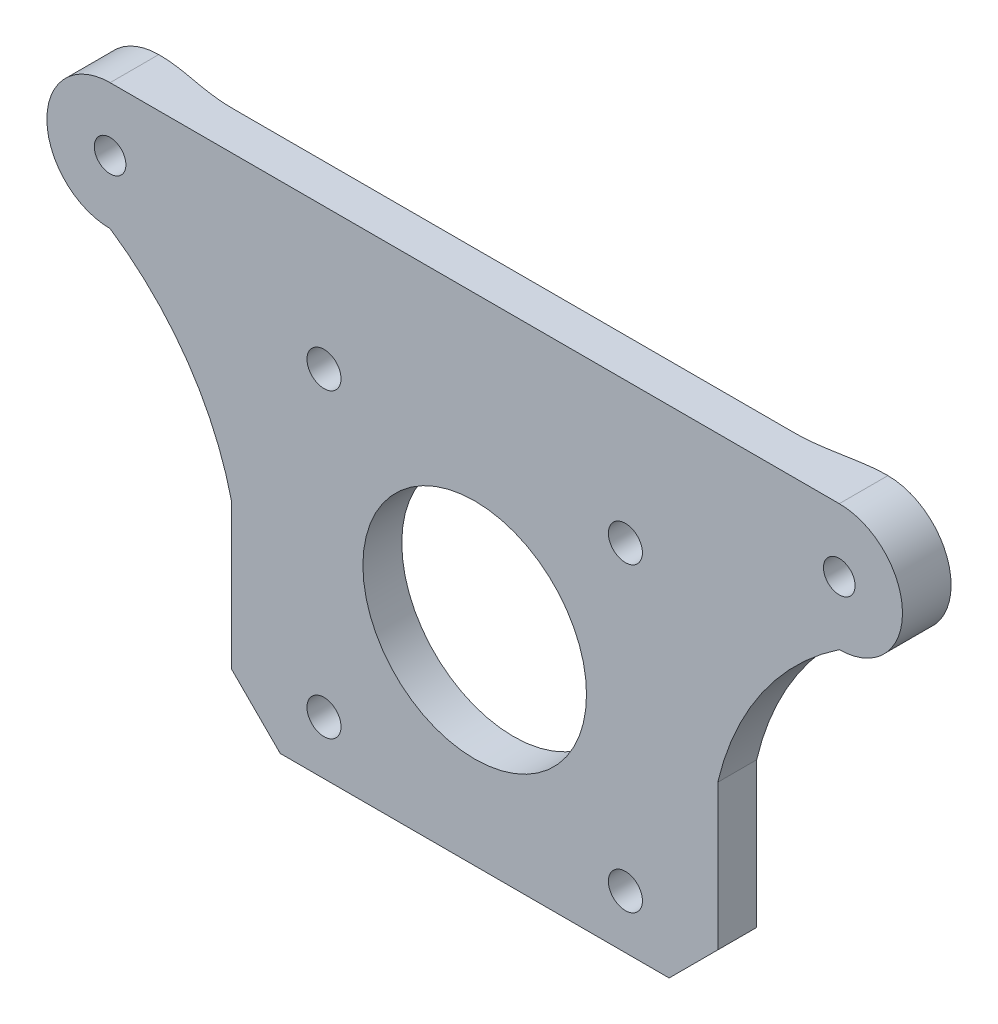
ISO-10303-21;
HEADER;
FILE_DESCRIPTION(('STEP AP214'),'2;1');
FILE_NAME('part.step','',(''),(''),'','','');
FILE_SCHEMA(('AUTOMOTIVE_DESIGN { 1 0 10303 214 1 1 1 1 }'));
ENDSEC;
DATA;
#1=APPLICATION_CONTEXT('core data for automotive mechanical design processes');
#2=APPLICATION_PROTOCOL_DEFINITION('international standard','automotive_design',2000,#1);
#3=PRODUCT_CONTEXT('',#1,'mechanical');
#4=PRODUCT('Part','Part','',(#3));
#5=PRODUCT_RELATED_PRODUCT_CATEGORY('part','',(#4));
#6=PRODUCT_DEFINITION_FORMATION('','',#4);
#7=PRODUCT_DEFINITION_CONTEXT('part definition',#1,'design');
#8=PRODUCT_DEFINITION('design','',#6,#7);
#9=PRODUCT_DEFINITION_SHAPE('','',#8);
#10=(LENGTH_UNIT() NAMED_UNIT(*) SI_UNIT(.MILLI.,.METRE.));
#11=(NAMED_UNIT(*) PLANE_ANGLE_UNIT() SI_UNIT($,.RADIAN.));
#12=(NAMED_UNIT(*) SI_UNIT($,.STERADIAN.) SOLID_ANGLE_UNIT());
#13=UNCERTAINTY_MEASURE_WITH_UNIT(LENGTH_MEASURE(1.E-05),#10,'distance_accuracy_value','');
#14=(GEOMETRIC_REPRESENTATION_CONTEXT(3) GLOBAL_UNCERTAINTY_ASSIGNED_CONTEXT((#13)) GLOBAL_UNIT_ASSIGNED_CONTEXT((#10,
#11,#12)) REPRESENTATION_CONTEXT('',''));
#15=CARTESIAN_POINT('',(0.,0.,0.));
#16=DIRECTION('',(0.,0.,1.));
#17=DIRECTION('',(1.,0.,0.));
#18=AXIS2_PLACEMENT_3D('',#15,#16,#17);
#19=CARTESIAN_POINT('',(-45.0000000000002,19.9343971588724,4.));
#20=DIRECTION('',(1.,0.,0.));
#21=DIRECTION('',(0.,0.,-1.));
#22=AXIS2_PLACEMENT_3D('',#19,#20,#21);
#23=PLANE('',#22);
#24=DIRECTION('',(0.,-1.,0.));
#25=VECTOR('',#24,1.);
#26=CARTESIAN_POINT('',(-45.0000000000002,19.9343971588724,0.));
#27=LINE('',#26,#25);
#28=CARTESIAN_POINT('',(-45.0000000000002,19.9343971588724,0.));
#29=VERTEX_POINT('',#28);
#30=CARTESIAN_POINT('',(-45.0000000000002,5.,0.));
#31=VERTEX_POINT('',#30);
#32=EDGE_CURVE('E154',#29,#31,#27,.T.);
#33=ORIENTED_EDGE('',*,*,#32,.T.);
#34=DIRECTION('',(0.,0.,-1.));
#35=VECTOR('',#34,1.);
#36=CARTESIAN_POINT('',(-45.0000000000002,5.,4.));
#37=LINE('',#36,#35);
#38=CARTESIAN_POINT('',(-45.0000000000002,5.,4.));
#39=VERTEX_POINT('',#38);
#40=EDGE_CURVE('E135',#39,#31,#37,.T.);
#41=ORIENTED_EDGE('',*,*,#40,.F.);
#42=DIRECTION('',(0.,-1.,0.));
#43=VECTOR('',#42,1.);
#44=CARTESIAN_POINT('',(-45.0000000000002,19.9343971588724,4.));
#45=LINE('',#44,#43);
#46=CARTESIAN_POINT('',(-45.0000000000002,19.9343971588724,4.));
#47=VERTEX_POINT('',#46);
#48=EDGE_CURVE('E142',#47,#39,#45,.T.);
#49=ORIENTED_EDGE('',*,*,#48,.F.);
#50=DIRECTION('',(0.,0.,-1.));
#51=VECTOR('',#50,1.);
#52=CARTESIAN_POINT('',(-45.0000000000002,19.9343971588724,4.));
#53=LINE('',#52,#51);
#54=EDGE_CURVE('E280',#47,#29,#53,.T.);
#55=ORIENTED_EDGE('',*,*,#54,.T.);
#56=EDGE_LOOP('',(#33,#41,#49,#55));
#57=FACE_BOUND('',#56,.T.);
#58=ADVANCED_FACE('F35',(#57),#23,.F.);
#59=CARTESIAN_POINT('',(-45.0000000000002,5.,4.));
#60=DIRECTION('',(0.707106781186548,0.707106781186547,0.));
#61=DIRECTION('',(-0.707106781186547,0.707106781186548,0.));
#62=AXIS2_PLACEMENT_3D('',#59,#60,#61);
#63=PLANE('',#62);
#64=DIRECTION('',(0.707106781186547,-0.707106781186548,0.));
#65=VECTOR('',#64,1.);
#66=CARTESIAN_POINT('',(-45.0000000000002,5.,0.));
#67=LINE('',#66,#65);
#68=CARTESIAN_POINT('',(-40.0000000000002,0.,0.));
#69=VERTEX_POINT('',#68);
#70=EDGE_CURVE('E282',#31,#69,#67,.T.);
#71=ORIENTED_EDGE('',*,*,#70,.T.);
#72=DIRECTION('',(0.,0.,-1.));
#73=VECTOR('',#72,1.);
#74=CARTESIAN_POINT('',(-40.0000000000002,0.,4.));
#75=LINE('',#74,#73);
#76=CARTESIAN_POINT('',(-40.0000000000002,0.,4.));
#77=VERTEX_POINT('',#76);
#78=EDGE_CURVE('E138',#77,#69,#75,.T.);
#79=ORIENTED_EDGE('',*,*,#78,.F.);
#80=DIRECTION('',(0.707106781186547,-0.707106781186548,0.));
#81=VECTOR('',#80,1.);
#82=CARTESIAN_POINT('',(-45.0000000000002,5.,4.));
#83=LINE('',#82,#81);
#84=EDGE_CURVE('E131',#39,#77,#83,.T.);
#85=ORIENTED_EDGE('',*,*,#84,.F.);
#86=ORIENTED_EDGE('',*,*,#40,.T.);
#87=EDGE_LOOP('',(#71,#79,#85,#86));
#88=FACE_BOUND('',#87,.T.);
#89=ADVANCED_FACE('F133',(#88),#63,.F.);
#90=CARTESIAN_POINT('',(-40.0000000000002,0.,4.));
#91=DIRECTION('',(0.,1.,0.));
#92=DIRECTION('',(0.,0.,1.));
#93=AXIS2_PLACEMENT_3D('',#90,#91,#92);
#94=PLANE('',#93);
#95=DIRECTION('',(1.,0.,0.));
#96=VECTOR('',#95,1.);
#97=CARTESIAN_POINT('',(-40.0000000000002,0.,0.));
#98=LINE('',#97,#96);
#99=CARTESIAN_POINT('',(0.,0.,0.));
#100=VERTEX_POINT('',#99);
#101=EDGE_CURVE('E284',#69,#100,#98,.T.);
#102=ORIENTED_EDGE('',*,*,#101,.T.);
#103=DIRECTION('',(0.,0.,-1.));
#104=VECTOR('',#103,1.);
#105=CARTESIAN_POINT('',(0.,0.,4.));
#106=LINE('',#105,#104);
#107=CARTESIAN_POINT('',(0.,0.,4.));
#108=VERTEX_POINT('',#107);
#109=EDGE_CURVE('E159',#108,#100,#106,.T.);
#110=ORIENTED_EDGE('',*,*,#109,.F.);
#111=DIRECTION('',(1.,0.,0.));
#112=VECTOR('',#111,1.);
#113=CARTESIAN_POINT('',(-40.0000000000002,0.,4.));
#114=LINE('',#113,#112);
#115=EDGE_CURVE('E141',#77,#108,#114,.T.);
#116=ORIENTED_EDGE('',*,*,#115,.F.);
#117=ORIENTED_EDGE('',*,*,#78,.T.);
#118=EDGE_LOOP('',(#102,#110,#116,#117));
#119=FACE_BOUND('',#118,.T.);
#120=ADVANCED_FACE('F211',(#119),#94,.F.);
#121=CARTESIAN_POINT('',(0.,0.,4.));
#122=DIRECTION('',(-0.707106781186548,0.707106781186547,0.));
#123=DIRECTION('',(-0.707106781186547,-0.707106781186548,0.));
#124=AXIS2_PLACEMENT_3D('',#121,#122,#123);
#125=PLANE('',#124);
#126=DIRECTION('',(0.707106781186547,0.707106781186548,0.));
#127=VECTOR('',#126,1.);
#128=CARTESIAN_POINT('',(0.,0.,0.));
#129=LINE('',#128,#127);
#130=CARTESIAN_POINT('',(4.99999999999994,4.99999999999994,0.));
#131=VERTEX_POINT('',#130);
#132=EDGE_CURVE('E286',#100,#131,#129,.T.);
#133=ORIENTED_EDGE('',*,*,#132,.T.);
#134=DIRECTION('',(0.,0.,-1.));
#135=VECTOR('',#134,1.);
#136=CARTESIAN_POINT('',(4.99999999999994,4.99999999999994,4.));
#137=LINE('',#136,#135);
#138=CARTESIAN_POINT('',(4.99999999999994,4.99999999999994,4.));
#139=VERTEX_POINT('',#138);
#140=EDGE_CURVE('E304',#139,#131,#137,.T.);
#141=ORIENTED_EDGE('',*,*,#140,.F.);
#142=DIRECTION('',(0.707106781186547,0.707106781186548,0.));
#143=VECTOR('',#142,1.);
#144=CARTESIAN_POINT('',(0.,0.,4.));
#145=LINE('',#144,#143);
#146=EDGE_CURVE('E267',#108,#139,#145,.T.);
#147=ORIENTED_EDGE('',*,*,#146,.F.);
#148=ORIENTED_EDGE('',*,*,#109,.T.);
#149=EDGE_LOOP('',(#133,#141,#147,#148));
#150=FACE_BOUND('',#149,.T.);
#151=ADVANCED_FACE('F214',(#150),#125,.F.);
#152=CARTESIAN_POINT('',(4.99999999999994,4.99999999999994,4.));
#153=DIRECTION('',(-1.,0.,0.));
#154=DIRECTION('',(0.,-1.,0.));
#155=AXIS2_PLACEMENT_3D('',#152,#153,#154);
#156=PLANE('',#155);
#157=DIRECTION('',(0.,1.,0.));
#158=VECTOR('',#157,1.);
#159=CARTESIAN_POINT('',(4.99999999999994,4.99999999999994,0.));
#160=LINE('',#159,#158);
#161=CARTESIAN_POINT('',(4.99999999999994,19.9343971588719,0.));
#162=VERTEX_POINT('',#161);
#163=EDGE_CURVE('E288',#131,#162,#160,.T.);
#164=ORIENTED_EDGE('',*,*,#163,.T.);
#165=DIRECTION('',(0.,0.,-1.));
#166=VECTOR('',#165,1.);
#167=CARTESIAN_POINT('',(4.99999999999994,19.9343971588719,4.));
#168=LINE('',#167,#166);
#169=CARTESIAN_POINT('',(4.99999999999994,19.9343971588719,4.));
#170=VERTEX_POINT('',#169);
#171=EDGE_CURVE('E301',#170,#162,#168,.T.);
#172=ORIENTED_EDGE('',*,*,#171,.F.);
#173=DIRECTION('',(0.,1.,0.));
#174=VECTOR('',#173,1.);
#175=CARTESIAN_POINT('',(4.99999999999994,4.99999999999994,4.));
#176=LINE('',#175,#174);
#177=EDGE_CURVE('E269',#139,#170,#176,.T.);
#178=ORIENTED_EDGE('',*,*,#177,.F.);
#179=ORIENTED_EDGE('',*,*,#140,.T.);
#180=EDGE_LOOP('',(#164,#172,#178,#179));
#181=FACE_BOUND('',#180,.T.);
#182=ADVANCED_FACE('F218',(#181),#156,.F.);
#183=CARTESIAN_POINT('',(34.2070855528039,13.082670842739,4.));
#184=DIRECTION('',(0.,0.,-1.));
#185=DIRECTION('',(-1.,0.,0.));
#186=AXIS2_PLACEMENT_3D('',#183,#184,#185);
#187=CYLINDRICAL_SURFACE('',#186,30.);
#188=CARTESIAN_POINT('',(34.2070855528039,13.082670842739,0.));
#189=DIRECTION('',(0.,0.,-1.));
#190=DIRECTION('',(1.,0.,0.));
#191=AXIS2_PLACEMENT_3D('',#188,#189,#190);
#192=CIRCLE('',#191,30.);
#193=CARTESIAN_POINT('',(13.2203898237343,34.5199888273995,0.));
#194=VERTEX_POINT('',#193);
#195=EDGE_CURVE('E290',#162,#194,#192,.T.);
#196=ORIENTED_EDGE('',*,*,#195,.T.);
#197=CARTESIAN_POINT('',(13.2203898237343,34.5199888273995,0.));
#198=CARTESIAN_POINT('',(13.3475571543626,34.6444886872579,1.47911738820404E-05));
#199=CARTESIAN_POINT('',(13.4758222592545,34.7678360827087,-0.00405988023108873));
#200=CARTESIAN_POINT('',(13.734229729742,35.0119592606232,-0.0199133642238461));
#201=CARTESIAN_POINT('',(13.8643714354159,35.1327359118167,-0.0316895301601826));
#202=CARTESIAN_POINT('',(14.1258912646325,35.3711626914131,-0.0624236407793277));
#203=CARTESIAN_POINT('',(14.2572642374358,35.4888214292575,-0.0813589707309442));
#204=CARTESIAN_POINT('',(14.5214331530349,35.7212671572359,-0.125842201259276));
#205=CARTESIAN_POINT('',(14.654229206909,35.8360539208321,-0.151390621676429));
#206=CARTESIAN_POINT('',(14.9200095485816,36.0617669984351,-0.208216161823547));
#207=CARTESIAN_POINT('',(15.0529841390559,36.1727165764805,-0.239446638663851));
#208=CARTESIAN_POINT('',(15.3200503253721,36.3916759941992,-0.307028345548682));
#209=CARTESIAN_POINT('',(15.454141982411,36.4996856714126,-0.343379857900362));
#210=CARTESIAN_POINT('',(15.7234727165503,36.7128543067511,-0.420374365618012));
#211=CARTESIAN_POINT('',(15.8587123922287,36.8180116403399,-0.461019744605796));
#212=CARTESIAN_POINT('',(16.1303081470024,37.0255054109899,-0.545608849080373));
#213=CARTESIAN_POINT('',(16.2666642103558,37.1278418877385,-0.589552528130163));
#214=CARTESIAN_POINT('',(16.4936309565833,37.2951887447456,-0.664156545026162));
#215=CARTESIAN_POINT('',(16.5838861815453,37.3609594617828,-0.694201738803661));
#216=CARTESIAN_POINT('',(16.7649729325249,37.4913814631052,-0.754851757931638));
#217=CARTESIAN_POINT('',(16.8558042856194,37.5560330634057,-0.78545642011005));
#218=CARTESIAN_POINT('',(17.0383902033836,37.6844674552848,-0.84691897958755));
#219=CARTESIAN_POINT('',(17.1301466037089,37.7482474152432,-0.877777338557704));
#220=CARTESIAN_POINT('',(17.3144574954795,37.8748390367395,-0.939214955247577));
#221=CARTESIAN_POINT('',(17.4070122001833,37.9376504262022,-0.969794133594629));
#222=CARTESIAN_POINT('',(17.5000000000001,38.,-1.));
#223=B_SPLINE_CURVE_WITH_KNOTS('',3,(#197,#198,#199,#200,#201,#202,#203,#204,#205,#206,#207,
#208,#209,#210,#211,#212,#213,#214,#215,#216,#217,#218,#219,#220,#221,#222),.UNSPECIFIED.,.F.,
.F.,(4,2,2,2,2,2,2,2,2,2,2,2,4),(0.,0.533810671535223,1.06743799308396,1.59939356120025,
2.13139095787461,2.6592036492269,3.18704544868609,3.71518182023237,4.24331075750331,
4.59024762349319,4.93708486867881,5.28486270861955,5.63273652356656),.UNSPECIFIED.);
#224=CARTESIAN_POINT('',(17.5000000000001,38.,-1.));
#225=VERTEX_POINT('',#224);
#226=EDGE_CURVE('E11',#194,#225,#223,.T.);
#227=ORIENTED_EDGE('',*,*,#226,.T.);
#228=DIRECTION('',(0.,0.,-1.));
#229=VECTOR('',#228,1.);
#230=CARTESIAN_POINT('',(17.5000000000001,38.,4.));
#231=LINE('',#230,#229);
#232=CARTESIAN_POINT('',(17.5000000000001,38.,4.));
#233=VERTEX_POINT('',#232);
#234=EDGE_CURVE('E55',#233,#225,#231,.T.);
#235=ORIENTED_EDGE('',*,*,#234,.F.);
#236=CARTESIAN_POINT('',(34.2070855528039,13.082670842739,4.));
#237=DIRECTION('',(0.,0.,-1.));
#238=DIRECTION('',(1.,0.,0.));
#239=AXIS2_PLACEMENT_3D('',#236,#237,#238);
#240=CIRCLE('',#239,30.);
#241=EDGE_CURVE('E271',#170,#233,#240,.T.);
#242=ORIENTED_EDGE('',*,*,#241,.F.);
#243=ORIENTED_EDGE('',*,*,#171,.T.);
#244=EDGE_LOOP('',(#196,#227,#235,#242,#243));
#245=FACE_BOUND('',#244,.T.);
#246=ADVANCED_FACE('F221',(#245),#187,.F.);
#247=CARTESIAN_POINT('',(17.5,44.5000000000001,4.));
#248=DIRECTION('',(0.,0.,-1.));
#249=DIRECTION('',(-1.,0.,0.));
#250=AXIS2_PLACEMENT_3D('',#247,#248,#249);
#251=CYLINDRICAL_SURFACE('',#250,6.50000000000001);
#252=CARTESIAN_POINT('',(17.5,44.5000000000001,-1.));
#253=DIRECTION('',(0.,0.,-1.));
#254=DIRECTION('',(-1.,0.,0.));
#255=AXIS2_PLACEMENT_3D('',#252,#253,#254);
#256=CIRCLE('',#255,6.5);
#257=CARTESIAN_POINT('',(17.5,51.0000000000001,-1.));
#258=VERTEX_POINT('',#257);
#259=EDGE_CURVE('E260',#258,#225,#256,.T.);
#260=ORIENTED_EDGE('',*,*,#259,.F.);
#261=DIRECTION('',(0.,0.,-1.));
#262=VECTOR('',#261,1.);
#263=CARTESIAN_POINT('',(17.5,51.0000000000001,4.));
#264=LINE('',#263,#262);
#265=CARTESIAN_POINT('',(17.5,51.0000000000001,4.));
#266=VERTEX_POINT('',#265);
#267=EDGE_CURVE('E62',#266,#258,#264,.T.);
#268=ORIENTED_EDGE('',*,*,#267,.F.);
#269=CARTESIAN_POINT('',(17.5,44.5000000000001,4.));
#270=DIRECTION('',(0.,0.,1.));
#271=DIRECTION('',(-1.,0.,0.));
#272=AXIS2_PLACEMENT_3D('',#269,#270,#271);
#273=CIRCLE('',#272,6.50000000000001);
#274=EDGE_CURVE('E273',#233,#266,#273,.T.);
#275=ORIENTED_EDGE('',*,*,#274,.F.);
#276=ORIENTED_EDGE('',*,*,#234,.T.);
#277=EDGE_LOOP('',(#260,#268,#275,#276));
#278=FACE_BOUND('',#277,.T.);
#279=ADVANCED_FACE('F226',(#278),#251,.T.);
#280=CARTESIAN_POINT('',(17.5,51.0000000000001,4.));
#281=DIRECTION('',(0.,-1.,0.));
#282=DIRECTION('',(1.,0.,0.));
#283=AXIS2_PLACEMENT_3D('',#280,#281,#282);
#284=PLANE('',#283);
#285=ORIENTED_EDGE('',*,*,#267,.T.);
#286=CARTESIAN_POINT('',(17.5,51.0000000000001,-1.));
#287=CARTESIAN_POINT('',(17.3608007393683,51.0000000000001,-1.00002857881053));
#288=CARTESIAN_POINT('',(17.221607707155,51.0000000000001,-0.997835010999121));
#289=CARTESIAN_POINT('',(16.9433797278018,51.0000000000001,-0.989214812747493));
#290=CARTESIAN_POINT('',(16.8043447545182,51.0000000000001,-0.982789032913835));
#291=CARTESIAN_POINT('',(16.5267748960686,51.0000000000001,-0.965930813390062));
#292=CARTESIAN_POINT('',(16.3882395612651,51.0000000000001,-0.955505675143));
#293=CARTESIAN_POINT('',(16.1114866371085,51.0000000000001,-0.93103701978664));
#294=CARTESIAN_POINT('',(15.9732690626938,51.0000000000001,-0.916993335936374));
#295=CARTESIAN_POINT('',(15.5597641005854,51.0000000000001,-0.870203033919158));
#296=CARTESIAN_POINT('',(15.2850108132887,51.0000000000001,-0.83275593590353));
#297=CARTESIAN_POINT('',(14.7366555337139,51.0000000000001,-0.749749717658406));
#298=CARTESIAN_POINT('',(14.4630541769181,51.0000000000001,-0.704186600971188));
#299=CARTESIAN_POINT('',(13.9179600727194,51.0000000000001,-0.609813766206603));
#300=CARTESIAN_POINT('',(13.6464639507195,51.0000000000001,-0.561023055382694));
#301=CARTESIAN_POINT('',(13.1033883082619,51.0000000000001,-0.464087815482583));
#302=CARTESIAN_POINT('',(12.8318088023142,51.0000000000001,-0.415943207055056));
#303=CARTESIAN_POINT('',(12.2880152464497,51.0000000000001,-0.323869969521894));
#304=CARTESIAN_POINT('',(12.0158014444479,51.0000000000001,-0.279939908590144));
#305=CARTESIAN_POINT('',(11.4703022380378,51.0000000000001,-0.19930669012682));
#306=CARTESIAN_POINT('',(11.1970169440332,51.0000000000001,-0.162602807003776));
#307=CARTESIAN_POINT('',(10.747173411367,51.0000000000001,-0.11033847861446));
#308=CARTESIAN_POINT('',(10.5709495104716,51.0000000000001,-0.0919095525378659));
#309=CARTESIAN_POINT('',(10.2180507632717,51.0000000000001,-0.0596684318199953));
#310=CARTESIAN_POINT('',(10.0413758594824,51.0000000000001,-0.0458568586986342));
#311=CARTESIAN_POINT('',(9.68757652025018,51.0000000000001,-0.0233815337411235));
#312=CARTESIAN_POINT('',(9.51045186644205,51.0000000000001,-0.0147211530274781));
#313=CARTESIAN_POINT('',(9.15602262913856,51.0000000000001,-0.0030258304127405));
#314=CARTESIAN_POINT('',(8.97871804902046,51.0000000000001,9.2151921399193E-06));
#315=CARTESIAN_POINT('',(8.80139745326706,51.0000000000001,0.));
#316=B_SPLINE_CURVE_WITH_KNOTS('',3,(#286,#287,#288,#289,#290,#291,#292,#293,#294,#295,#296,
#297,#298,#299,#300,#301,#302,#303,#304,#305,#306,#307,#308,#309,#310,#311,#312,#313,#314,#315),
.UNSPECIFIED.,.F.,.F.,(4,2,2,2,2,2,2,2,2,2,2,2,2,2,4),(0.,0.417570472455252,0.835057045559641,
1.2517850323574,1.66853222522999,2.50018348354976,3.33224539809817,4.15978148164269,
4.98721498334781,5.81436637464151,6.64143466800255,7.1729376405265,7.7045121273584,
8.2364341136644,8.76834629382149),.UNSPECIFIED.);
#317=CARTESIAN_POINT('',(8.80139745326706,51.0000000000001,0.));
#318=VERTEX_POINT('',#317);
#319=EDGE_CURVE('E48',#258,#318,#316,.T.);
#320=ORIENTED_EDGE('',*,*,#319,.T.);
#321=DIRECTION('',(-1.,0.,0.));
#322=VECTOR('',#321,1.);
#323=CARTESIAN_POINT('',(17.5,51.0000000000001,0.));
#324=LINE('',#323,#322);
#325=CARTESIAN_POINT('',(-48.8013974532672,51.,0.));
#326=VERTEX_POINT('',#325);
#327=EDGE_CURVE('E245',#318,#326,#324,.T.);
#328=ORIENTED_EDGE('',*,*,#327,.T.);
#329=CARTESIAN_POINT('',(-48.8013974532672,51.,0.));
#330=CARTESIAN_POINT('',(-48.9843317314412,51.,1.02708586909464E-05));
#331=CARTESIAN_POINT('',(-49.1672478880302,51.,-0.00322048569218536));
#332=CARTESIAN_POINT('',(-49.5328333902521,51.,-0.0156518396148824));
#333=CARTESIAN_POINT('',(-49.7155027868329,51.,-0.024850918153901));
#334=CARTESIAN_POINT('',(-50.0800310452254,51.,-0.0486780385179388));
#335=CARTESIAN_POINT('',(-50.2618907966961,51.,-0.063292745175868));
#336=CARTESIAN_POINT('',(-50.6251621111059,51.,-0.0973628539906389));
#337=CARTESIAN_POINT('',(-50.8065736450267,51.,-0.116818561675181));
#338=CARTESIAN_POINT('',(-51.3498347489808,51.,-0.181470671604734));
#339=CARTESIAN_POINT('',(-51.7109317954898,51.,-0.232968008772332));
#340=CARTESIAN_POINT('',(-52.4316769932501,51.,-0.346684626951029));
#341=CARTESIAN_POINT('',(-52.7913235274605,51.,-0.408913619872174));
#342=CARTESIAN_POINT('',(-53.5104915745454,51.,-0.536445439950984));
#343=CARTESIAN_POINT('',(-53.8700124563882,51.,-0.601751755326025));
#344=CARTESIAN_POINT('',(-54.4099565558486,51.,-0.694854176891613));
#345=CARTESIAN_POINT('',(-54.5899541197052,51.,-0.725064283544302));
#346=CARTESIAN_POINT('',(-54.950425900512,51.,-0.782564915856416));
#347=CARTESIAN_POINT('',(-55.1309001286593,51.,-0.809855372295854));
#348=CARTESIAN_POINT('',(-55.4926300159847,51.,-0.860231471531355));
#349=CARTESIAN_POINT('',(-55.6738862778992,51.,-0.883312864161988));
#350=CARTESIAN_POINT('',(-56.0369998464228,51.,-0.923985186773176));
#351=CARTESIAN_POINT('',(-56.2188570706509,51.,-0.941576840120889));
#352=CARTESIAN_POINT('',(-56.5837308191026,51.,-0.970270665414655));
#353=CARTESIAN_POINT('',(-56.7667491781158,51.,-0.981350222741181));
#354=CARTESIAN_POINT('',(-57.0415396244532,51.,-0.992502293037613));
#355=CARTESIAN_POINT('',(-57.133206103088,51.,-0.995308458407339));
#356=CARTESIAN_POINT('',(-57.3165808203083,51.,-0.999059440176797));
#357=CARTESIAN_POINT('',(-57.4082890604688,51.,-1.00000417933898));
#358=CARTESIAN_POINT('',(-57.5,51.,-1.));
#359=B_SPLINE_CURVE_WITH_KNOTS('',3,(#329,#330,#331,#332,#333,#334,#335,#336,#337,#338,#339,
#340,#341,#342,#343,#344,#345,#346,#347,#348,#349,#350,#351,#352,#353,#354,#355,#356,#357,#358),
.UNSPECIFIED.,.F.,.F.,(4,2,2,2,2,2,2,2,2,2,2,2,2,2,4),(0.,0.548747589337283,1.09735558682608,
1.64462160039922,2.19192216206588,3.28585938526092,4.38079184287164,5.47699677883071,
6.0245271095058,6.57207041832699,7.12016359216997,7.66818451482712,8.21809747945168,
8.49320891751224,8.76833177073734),.UNSPECIFIED.);
#360=CARTESIAN_POINT('',(-57.5,51.,-1.));
#361=VERTEX_POINT('',#360);
#362=EDGE_CURVE('E191',#326,#361,#359,.T.);
#363=ORIENTED_EDGE('',*,*,#362,.T.);
#364=DIRECTION('',(0.,0.,-1.));
#365=VECTOR('',#364,1.);
#366=CARTESIAN_POINT('',(-57.5,51.,4.));
#367=LINE('',#366,#365);
#368=CARTESIAN_POINT('',(-57.5,51.,4.));
#369=VERTEX_POINT('',#368);
#370=EDGE_CURVE('E243',#369,#361,#367,.T.);
#371=ORIENTED_EDGE('',*,*,#370,.F.);
#372=DIRECTION('',(-1.,0.,0.));
#373=VECTOR('',#372,1.);
#374=CARTESIAN_POINT('',(17.5,51.0000000000001,4.));
#375=LINE('',#374,#373);
#376=EDGE_CURVE('E275',#266,#369,#375,.T.);
#377=ORIENTED_EDGE('',*,*,#376,.F.);
#378=EDGE_LOOP('',(#285,#320,#328,#363,#371,#377));
#379=FACE_BOUND('',#378,.T.);
#380=ADVANCED_FACE('F229',(#379),#284,.F.);
#381=CARTESIAN_POINT('',(-57.5000000000001,44.5000000000001,4.));
#382=DIRECTION('',(0.,0.,-1.));
#383=DIRECTION('',(-1.,0.,0.));
#384=AXIS2_PLACEMENT_3D('',#381,#382,#383);
#385=CYLINDRICAL_SURFACE('',#384,6.49999999999999);
#386=CARTESIAN_POINT('',(-57.5000000000001,44.5000000000001,-1.));
#387=DIRECTION('',(0.,0.,-1.));
#388=DIRECTION('',(-1.,0.,0.));
#389=AXIS2_PLACEMENT_3D('',#386,#387,#388);
#390=CIRCLE('',#389,6.5);
#391=CARTESIAN_POINT('',(-57.5000000000002,38.0000000000001,-1.));
#392=VERTEX_POINT('',#391);
#393=EDGE_CURVE('E251',#392,#361,#390,.T.);
#394=ORIENTED_EDGE('',*,*,#393,.F.);
#395=DIRECTION('',(0.,0.,-1.));
#396=VECTOR('',#395,1.);
#397=CARTESIAN_POINT('',(-57.5000000000002,38.0000000000001,4.));
#398=LINE('',#397,#396);
#399=CARTESIAN_POINT('',(-57.5000000000002,38.0000000000001,4.));
#400=VERTEX_POINT('',#399);
#401=EDGE_CURVE('E296',#400,#392,#398,.T.);
#402=ORIENTED_EDGE('',*,*,#401,.F.);
#403=CARTESIAN_POINT('',(-57.5000000000001,44.5000000000001,4.));
#404=DIRECTION('',(0.,0.,1.));
#405=DIRECTION('',(1.,0.,0.));
#406=AXIS2_PLACEMENT_3D('',#403,#404,#405);
#407=CIRCLE('',#406,6.49999999999999);
#408=EDGE_CURVE('E277',#369,#400,#407,.T.);
#409=ORIENTED_EDGE('',*,*,#408,.F.);
#410=ORIENTED_EDGE('',*,*,#370,.T.);
#411=EDGE_LOOP('',(#394,#402,#409,#410));
#412=FACE_BOUND('',#411,.T.);
#413=ADVANCED_FACE('F232',(#412),#385,.T.);
#414=CARTESIAN_POINT('',(-74.2070855528041,13.082670842739,4.));
#415=DIRECTION('',(0.,0.,-1.));
#416=DIRECTION('',(-1.,0.,0.));
#417=AXIS2_PLACEMENT_3D('',#414,#415,#416);
#418=CYLINDRICAL_SURFACE('',#417,30.);
#419=ORIENTED_EDGE('',*,*,#401,.T.);
#420=CARTESIAN_POINT('',(-57.5000000000002,38.0000000000001,-1.));
#421=CARTESIAN_POINT('',(-57.405768016431,37.9368161390863,-0.969389687891291));
#422=CARTESIAN_POINT('',(-57.3119807916804,37.8731580778459,-0.93839637123324));
#423=CARTESIAN_POINT('',(-57.1251972830515,37.7448270615607,-0.87612006938612));
#424=CARTESIAN_POINT('',(-57.0322010134558,37.6801540882491,-0.844837078987531));
#425=CARTESIAN_POINT('',(-56.8468567326145,37.5496955968265,-0.782442919152699));
#426=CARTESIAN_POINT('',(-56.7545090781272,37.4839095253827,-0.751331846018733));
#427=CARTESIAN_POINT('',(-56.5704346865456,37.3511981818908,-0.689714030038396));
#428=CARTESIAN_POINT('',(-56.4787079453365,37.2842729174022,-0.659207283184718));
#429=CARTESIAN_POINT('',(-56.2057039807171,37.0826959981287,-0.569614531898618));
#430=CARTESIAN_POINT('',(-56.0252374737137,36.9462821446965,-0.511984100318326));
#431=CARTESIAN_POINT('',(-55.6662381315072,36.668439254382,-0.403204077145904));
#432=CARTESIAN_POINT('',(-55.4877050318013,36.5270109151247,-0.352053588544334));
#433=CARTESIAN_POINT('',(-55.1318408978221,36.2383984584487,-0.258146316149767));
#434=CARTESIAN_POINT('',(-54.954517433751,36.0911937476586,-0.21542360831261));
#435=CARTESIAN_POINT('',(-54.6020545123848,35.7916171106028,-0.140415216718448));
#436=CARTESIAN_POINT('',(-54.4269147852358,35.6392458316239,-0.108128230834449));
#437=CARTESIAN_POINT('',(-54.077992795202,35.3284472115725,-0.0552819696978948));
#438=CARTESIAN_POINT('',(-53.9042285664181,35.1699849957999,-0.034806210541731));
#439=CARTESIAN_POINT('',(-53.6459468927802,34.9288027421762,-0.0140732192776375));
#440=CARTESIAN_POINT('',(-53.5602111554247,34.8477919741726,-0.00882555761271345));
#441=CARTESIAN_POINT('',(-53.3896198133813,34.684685851712,-0.00178799703483655));
#442=CARTESIAN_POINT('',(-53.3047642904481,34.6025903980906,1.58349949034806E-06));
#443=CARTESIAN_POINT('',(-53.2203898237344,34.5199888273995,0.));
#444=B_SPLINE_CURVE_WITH_KNOTS('',3,(#420,#421,#422,#423,#424,#425,#426,#427,#428,#429,#430,
#431,#432,#433,#434,#435,#436,#437,#438,#439,#440,#441,#442,#443),.UNSPECIFIED.,.F.,.F.,(4,2,2,
2,2,2,2,2,2,2,2,4),(0.,0.35252838123671,0.705063114736317,1.05777856959673,1.41049168480545,
2.11071373506745,2.81083874840677,3.51373902286339,4.21655155839075,4.92427455223383,
5.27843741194175,5.63263287716382),.UNSPECIFIED.);
#445=CARTESIAN_POINT('',(-53.2203898237344,34.5199888273995,0.));
#446=VERTEX_POINT('',#445);
#447=EDGE_CURVE('E185',#392,#446,#444,.T.);
#448=ORIENTED_EDGE('',*,*,#447,.T.);
#449=CARTESIAN_POINT('',(-74.2070855528041,13.082670842739,0.));
#450=DIRECTION('',(0.,0.,-1.));
#451=DIRECTION('',(-1.,0.,0.));
#452=AXIS2_PLACEMENT_3D('',#449,#450,#451);
#453=CIRCLE('',#452,30.);
#454=EDGE_CURVE('E151',#446,#29,#453,.T.);
#455=ORIENTED_EDGE('',*,*,#454,.T.);
#456=ORIENTED_EDGE('',*,*,#54,.F.);
#457=CARTESIAN_POINT('',(-74.2070855528041,13.082670842739,4.));
#458=DIRECTION('',(0.,0.,-1.));
#459=DIRECTION('',(-1.,0.,0.));
#460=AXIS2_PLACEMENT_3D('',#457,#458,#459);
#461=CIRCLE('',#460,30.);
#462=EDGE_CURVE('E147',#400,#47,#461,.T.);
#463=ORIENTED_EDGE('',*,*,#462,.F.);
#464=EDGE_LOOP('',(#419,#448,#455,#456,#463));
#465=FACE_BOUND('',#464,.T.);
#466=ADVANCED_FACE('F196',(#465),#418,.F.);
#467=CARTESIAN_POINT('',(34.2070855528039,13.082670842739,4.));
#468=DIRECTION('',(0.,0.,1.));
#469=DIRECTION('',(1.,0.,0.));
#470=AXIS2_PLACEMENT_3D('',#467,#468,#469);
#471=PLANE('',#470);
#472=CARTESIAN_POINT('',(-57.5000000000001,44.5000000000001,4.));
#473=DIRECTION('',(0.,0.,1.));
#474=DIRECTION('',(1.,0.,0.));
#475=AXIS2_PLACEMENT_3D('',#472,#473,#474);
#476=CIRCLE('',#475,1.625);
#477=CARTESIAN_POINT('',(-55.8750000000001,44.5000000000001,4.));
#478=VERTEX_POINT('',#477);
#479=EDGE_CURVE('E403',#478,#478,#476,.T.);
#480=ORIENTED_EDGE('',*,*,#479,.F.);
#481=EDGE_LOOP('',(#480));
#482=FACE_BOUND('',#481,.T.);
#483=CARTESIAN_POINT('',(17.5,44.5000000000001,4.));
#484=DIRECTION('',(0.,0.,1.));
#485=DIRECTION('',(1.,0.,0.));
#486=AXIS2_PLACEMENT_3D('',#483,#484,#485);
#487=CIRCLE('',#486,1.625);
#488=CARTESIAN_POINT('',(19.125,44.5000000000001,4.));
#489=VERTEX_POINT('',#488);
#490=EDGE_CURVE('E172',#489,#489,#487,.T.);
#491=ORIENTED_EDGE('',*,*,#490,.F.);
#492=EDGE_LOOP('',(#491));
#493=FACE_BOUND('',#492,.T.);
#494=CARTESIAN_POINT('',(-4.5000000000002,5.49999999999999,4.));
#495=DIRECTION('',(0.,0.,1.));
#496=DIRECTION('',(1.,0.,0.));
#497=AXIS2_PLACEMENT_3D('',#494,#495,#496);
#498=CIRCLE('',#497,1.75);
#499=CARTESIAN_POINT('',(-2.7500000000002,5.49999999999999,4.));
#500=VERTEX_POINT('',#499);
#501=EDGE_CURVE('E167',#500,#500,#498,.T.);
#502=ORIENTED_EDGE('',*,*,#501,.F.);
#503=EDGE_LOOP('',(#502));
#504=FACE_BOUND('',#503,.T.);
#505=CARTESIAN_POINT('',(-35.5000000000002,5.50000000000001,4.));
#506=DIRECTION('',(0.,0.,1.));
#507=DIRECTION('',(1.,0.,0.));
#508=AXIS2_PLACEMENT_3D('',#505,#506,#507);
#509=CIRCLE('',#508,1.75);
#510=CARTESIAN_POINT('',(-33.7500000000002,5.50000000000001,4.));
#511=VERTEX_POINT('',#510);
#512=EDGE_CURVE('E180',#511,#511,#509,.T.);
#513=ORIENTED_EDGE('',*,*,#512,.F.);
#514=EDGE_LOOP('',(#513));
#515=FACE_BOUND('',#514,.T.);
#516=CARTESIAN_POINT('',(-35.5000000000002,36.5,4.));
#517=DIRECTION('',(0.,0.,1.));
#518=DIRECTION('',(1.,0.,0.));
#519=AXIS2_PLACEMENT_3D('',#516,#517,#518);
#520=CIRCLE('',#519,1.75);
#521=CARTESIAN_POINT('',(-33.7500000000002,36.5,4.));
#522=VERTEX_POINT('',#521);
#523=EDGE_CURVE('E176',#522,#522,#520,.T.);
#524=ORIENTED_EDGE('',*,*,#523,.F.);
#525=EDGE_LOOP('',(#524));
#526=FACE_BOUND('',#525,.T.);
#527=CARTESIAN_POINT('',(-4.50000000000021,36.5,4.));
#528=DIRECTION('',(0.,0.,1.));
#529=DIRECTION('',(1.,0.,0.));
#530=AXIS2_PLACEMENT_3D('',#527,#528,#529);
#531=CIRCLE('',#530,1.75);
#532=CARTESIAN_POINT('',(-2.75000000000021,36.5,4.));
#533=VERTEX_POINT('',#532);
#534=EDGE_CURVE('E171',#533,#533,#531,.T.);
#535=ORIENTED_EDGE('',*,*,#534,.F.);
#536=EDGE_LOOP('',(#535));
#537=FACE_BOUND('',#536,.T.);
#538=CARTESIAN_POINT('',(-20.0000000000002,21.,4.));
#539=DIRECTION('',(0.,0.,1.));
#540=DIRECTION('',(1.,0.,0.));
#541=AXIS2_PLACEMENT_3D('',#538,#539,#540);
#542=CIRCLE('',#541,11.5);
#543=CARTESIAN_POINT('',(-8.5000000000002,21.,4.));
#544=VERTEX_POINT('',#543);
#545=EDGE_CURVE('E166',#544,#544,#542,.T.);
#546=ORIENTED_EDGE('',*,*,#545,.F.);
#547=EDGE_LOOP('',(#546));
#548=FACE_BOUND('',#547,.T.);
#549=ORIENTED_EDGE('',*,*,#48,.T.);
#550=ORIENTED_EDGE('',*,*,#84,.T.);
#551=ORIENTED_EDGE('',*,*,#115,.T.);
#552=ORIENTED_EDGE('',*,*,#146,.T.);
#553=ORIENTED_EDGE('',*,*,#177,.T.);
#554=ORIENTED_EDGE('',*,*,#241,.T.);
#555=ORIENTED_EDGE('',*,*,#274,.T.);
#556=ORIENTED_EDGE('',*,*,#376,.T.);
#557=ORIENTED_EDGE('',*,*,#408,.T.);
#558=ORIENTED_EDGE('',*,*,#462,.T.);
#559=EDGE_LOOP('',(#549,#550,#551,#552,#553,#554,#555,#556,#557,#558));
#560=FACE_BOUND('',#559,.T.);
#561=ADVANCED_FACE('F145',(#482,#493,#504,#515,#526,#537,#548,#560),#471,.T.);
#562=CARTESIAN_POINT('',(34.2070855528039,13.082670842739,0.));
#563=DIRECTION('',(0.,0.,1.));
#564=DIRECTION('',(1.,0.,0.));
#565=AXIS2_PLACEMENT_3D('',#562,#563,#564);
#566=PLANE('',#565);
#567=CARTESIAN_POINT('',(-4.5000000000002,5.49999999999999,0.));
#568=DIRECTION('',(0.,0.,1.));
#569=DIRECTION('',(1.,0.,0.));
#570=AXIS2_PLACEMENT_3D('',#567,#568,#569);
#571=CIRCLE('',#570,1.75);
#572=CARTESIAN_POINT('',(-2.7500000000002,5.49999999999999,0.));
#573=VERTEX_POINT('',#572);
#574=EDGE_CURVE('E181',#573,#573,#571,.T.);
#575=ORIENTED_EDGE('',*,*,#574,.T.);
#576=EDGE_LOOP('',(#575));
#577=FACE_BOUND('',#576,.T.);
#578=CARTESIAN_POINT('',(-35.5000000000002,5.50000000000001,0.));
#579=DIRECTION('',(0.,0.,1.));
#580=DIRECTION('',(1.,0.,0.));
#581=AXIS2_PLACEMENT_3D('',#578,#579,#580);
#582=CIRCLE('',#581,1.75);
#583=CARTESIAN_POINT('',(-33.7500000000002,5.50000000000001,0.));
#584=VERTEX_POINT('',#583);
#585=EDGE_CURVE('E177',#584,#584,#582,.T.);
#586=ORIENTED_EDGE('',*,*,#585,.T.);
#587=EDGE_LOOP('',(#586));
#588=FACE_BOUND('',#587,.T.);
#589=CARTESIAN_POINT('',(-35.5000000000002,36.5,0.));
#590=DIRECTION('',(0.,0.,1.));
#591=DIRECTION('',(1.,0.,0.));
#592=AXIS2_PLACEMENT_3D('',#589,#590,#591);
#593=CIRCLE('',#592,1.75);
#594=CARTESIAN_POINT('',(-33.7500000000002,36.5,0.));
#595=VERTEX_POINT('',#594);
#596=EDGE_CURVE('E173',#595,#595,#593,.T.);
#597=ORIENTED_EDGE('',*,*,#596,.T.);
#598=EDGE_LOOP('',(#597));
#599=FACE_BOUND('',#598,.T.);
#600=CARTESIAN_POINT('',(-4.50000000000021,36.5,0.));
#601=DIRECTION('',(0.,0.,1.));
#602=DIRECTION('',(1.,0.,0.));
#603=AXIS2_PLACEMENT_3D('',#600,#601,#602);
#604=CIRCLE('',#603,1.75);
#605=CARTESIAN_POINT('',(-2.75000000000021,36.5,0.));
#606=VERTEX_POINT('',#605);
#607=EDGE_CURVE('E168',#606,#606,#604,.T.);
#608=ORIENTED_EDGE('',*,*,#607,.T.);
#609=EDGE_LOOP('',(#608));
#610=FACE_BOUND('',#609,.T.);
#611=CARTESIAN_POINT('',(-20.0000000000002,21.,0.));
#612=DIRECTION('',(0.,0.,1.));
#613=DIRECTION('',(1.,0.,0.));
#614=AXIS2_PLACEMENT_3D('',#611,#612,#613);
#615=CIRCLE('',#614,11.5);
#616=CARTESIAN_POINT('',(-8.5000000000002,21.,0.));
#617=VERTEX_POINT('',#616);
#618=EDGE_CURVE('E163',#617,#617,#615,.T.);
#619=ORIENTED_EDGE('',*,*,#618,.T.);
#620=EDGE_LOOP('',(#619));
#621=FACE_BOUND('',#620,.T.);
#622=ORIENTED_EDGE('',*,*,#454,.F.);
#623=CARTESIAN_POINT('',(-57.5000000000001,44.5000000000001,0.));
#624=DIRECTION('',(0.,0.,1.));
#625=DIRECTION('',(1.,0.,0.));
#626=AXIS2_PLACEMENT_3D('',#623,#624,#625);
#627=CIRCLE('',#626,10.8588989435407);
#628=EDGE_CURVE('E157',#446,#326,#627,.T.);
#629=ORIENTED_EDGE('',*,*,#628,.T.);
#630=ORIENTED_EDGE('',*,*,#327,.F.);
#631=CARTESIAN_POINT('',(17.5,44.5000000000001,0.));
#632=DIRECTION('',(0.,0.,1.));
#633=DIRECTION('',(1.,0.,0.));
#634=AXIS2_PLACEMENT_3D('',#631,#632,#633);
#635=CIRCLE('',#634,10.8588989435407);
#636=EDGE_CURVE('E155',#318,#194,#635,.T.);
#637=ORIENTED_EDGE('',*,*,#636,.T.);
#638=ORIENTED_EDGE('',*,*,#195,.F.);
#639=ORIENTED_EDGE('',*,*,#163,.F.);
#640=ORIENTED_EDGE('',*,*,#132,.F.);
#641=ORIENTED_EDGE('',*,*,#101,.F.);
#642=ORIENTED_EDGE('',*,*,#70,.F.);
#643=ORIENTED_EDGE('',*,*,#32,.F.);
#644=EDGE_LOOP('',(#622,#629,#630,#637,#638,#639,#640,#641,#642,#643));
#645=FACE_BOUND('',#644,.T.);
#646=ADVANCED_FACE('F315',(#577,#588,#599,#610,#621,#645),#566,.F.);
#647=CARTESIAN_POINT('',(17.5,44.5000000000001,-1.));
#648=DIRECTION('',(0.,0.,-1.));
#649=DIRECTION('',(-1.,0.,0.));
#650=AXIS2_PLACEMENT_3D('',#647,#648,#649);
#651=PLANE('',#650);
#652=CARTESIAN_POINT('',(17.5,44.5000000000001,-1.));
#653=DIRECTION('',(0.,0.,-1.));
#654=DIRECTION('',(-1.,0.,0.));
#655=AXIS2_PLACEMENT_3D('',#652,#653,#654);
#656=CIRCLE('',#655,1.625);
#657=CARTESIAN_POINT('',(15.875,44.5000000000001,-1.));
#658=VERTEX_POINT('',#657);
#659=EDGE_CURVE('E406',#658,#658,#656,.T.);
#660=ORIENTED_EDGE('',*,*,#659,.F.);
#661=EDGE_LOOP('',(#660));
#662=FACE_BOUND('',#661,.T.);
#663=ORIENTED_EDGE('',*,*,#259,.T.);
#664=EDGE_CURVE('E258',#225,#258,#256,.T.);
#665=ORIENTED_EDGE('',*,*,#664,.T.);
#666=EDGE_LOOP('',(#663,#665));
#667=FACE_BOUND('',#666,.T.);
#668=ADVANCED_FACE('F323',(#662,#667),#651,.T.);
#669=CARTESIAN_POINT('',(-57.5000000000001,44.5000000000001,-1.));
#670=DIRECTION('',(0.,0.,-1.));
#671=DIRECTION('',(-1.,0.,0.));
#672=AXIS2_PLACEMENT_3D('',#669,#670,#671);
#673=PLANE('',#672);
#674=CARTESIAN_POINT('',(-57.5000000000001,44.5000000000001,-1.));
#675=DIRECTION('',(0.,0.,-1.));
#676=DIRECTION('',(-1.,0.,0.));
#677=AXIS2_PLACEMENT_3D('',#674,#675,#676);
#678=CIRCLE('',#677,1.625);
#679=CARTESIAN_POINT('',(-59.1250000000001,44.5000000000001,-1.));
#680=VERTEX_POINT('',#679);
#681=EDGE_CURVE('E407',#680,#680,#678,.T.);
#682=ORIENTED_EDGE('',*,*,#681,.F.);
#683=EDGE_LOOP('',(#682));
#684=FACE_BOUND('',#683,.T.);
#685=EDGE_CURVE('E253',#361,#392,#390,.T.);
#686=ORIENTED_EDGE('',*,*,#685,.T.);
#687=ORIENTED_EDGE('',*,*,#393,.T.);
#688=EDGE_LOOP('',(#686,#687));
#689=FACE_BOUND('',#688,.T.);
#690=ADVANCED_FACE('F252',(#684,#689),#673,.T.);
#691=CARTESIAN_POINT('',(-20.0000000000002,21.,21.));
#692=DIRECTION('',(0.,0.,-1.));
#693=DIRECTION('',(-1.,0.,0.));
#694=AXIS2_PLACEMENT_3D('',#691,#692,#693);
#695=CYLINDRICAL_SURFACE('',#694,11.5);
#696=ORIENTED_EDGE('',*,*,#545,.T.);
#697=EDGE_LOOP('',(#696));
#698=FACE_BOUND('',#697,.T.);
#699=ORIENTED_EDGE('',*,*,#618,.F.);
#700=EDGE_LOOP('',(#699));
#701=FACE_BOUND('',#700,.T.);
#702=ADVANCED_FACE('F348',(#698,#701),#695,.F.);
#703=CARTESIAN_POINT('',(-57.5000000000001,44.5000000000001,21.));
#704=DIRECTION('',(0.,0.,-1.));
#705=DIRECTION('',(-1.,0.,0.));
#706=AXIS2_PLACEMENT_3D('',#703,#704,#705);
#707=CYLINDRICAL_SURFACE('',#706,1.625);
#708=ORIENTED_EDGE('',*,*,#479,.T.);
#709=EDGE_LOOP('',(#708));
#710=FACE_BOUND('',#709,.T.);
#711=ORIENTED_EDGE('',*,*,#681,.T.);
#712=EDGE_LOOP('',(#711));
#713=FACE_BOUND('',#712,.T.);
#714=ADVANCED_FACE('F352',(#710,#713),#707,.F.);
#715=CARTESIAN_POINT('',(17.5,44.5000000000001,21.));
#716=DIRECTION('',(0.,0.,-1.));
#717=DIRECTION('',(-1.,0.,0.));
#718=AXIS2_PLACEMENT_3D('',#715,#716,#717);
#719=CYLINDRICAL_SURFACE('',#718,1.625);
#720=ORIENTED_EDGE('',*,*,#490,.T.);
#721=EDGE_LOOP('',(#720));
#722=FACE_BOUND('',#721,.T.);
#723=ORIENTED_EDGE('',*,*,#659,.T.);
#724=EDGE_LOOP('',(#723));
#725=FACE_BOUND('',#724,.T.);
#726=ADVANCED_FACE('F365',(#722,#725),#719,.F.);
#727=CARTESIAN_POINT('',(-4.50000000000021,36.5,21.));
#728=DIRECTION('',(0.,0.,-1.));
#729=DIRECTION('',(-1.,0.,0.));
#730=AXIS2_PLACEMENT_3D('',#727,#728,#729);
#731=CYLINDRICAL_SURFACE('',#730,1.75);
#732=ORIENTED_EDGE('',*,*,#534,.T.);
#733=EDGE_LOOP('',(#732));
#734=FACE_BOUND('',#733,.T.);
#735=ORIENTED_EDGE('',*,*,#607,.F.);
#736=EDGE_LOOP('',(#735));
#737=FACE_BOUND('',#736,.T.);
#738=ADVANCED_FACE('F361',(#734,#737),#731,.F.);
#739=CARTESIAN_POINT('',(-35.5000000000002,36.5,21.));
#740=DIRECTION('',(0.,0.,-1.));
#741=DIRECTION('',(-1.,0.,0.));
#742=AXIS2_PLACEMENT_3D('',#739,#740,#741);
#743=CYLINDRICAL_SURFACE('',#742,1.75);
#744=ORIENTED_EDGE('',*,*,#523,.T.);
#745=EDGE_LOOP('',(#744));
#746=FACE_BOUND('',#745,.T.);
#747=ORIENTED_EDGE('',*,*,#596,.F.);
#748=EDGE_LOOP('',(#747));
#749=FACE_BOUND('',#748,.T.);
#750=ADVANCED_FACE('F357',(#746,#749),#743,.F.);
#751=CARTESIAN_POINT('',(-35.5000000000002,5.50000000000001,21.));
#752=DIRECTION('',(0.,0.,-1.));
#753=DIRECTION('',(-1.,0.,0.));
#754=AXIS2_PLACEMENT_3D('',#751,#752,#753);
#755=CYLINDRICAL_SURFACE('',#754,1.75);
#756=ORIENTED_EDGE('',*,*,#512,.T.);
#757=EDGE_LOOP('',(#756));
#758=FACE_BOUND('',#757,.T.);
#759=ORIENTED_EDGE('',*,*,#585,.F.);
#760=EDGE_LOOP('',(#759));
#761=FACE_BOUND('',#760,.T.);
#762=ADVANCED_FACE('F354',(#758,#761),#755,.F.);
#763=CARTESIAN_POINT('',(-4.5000000000002,5.49999999999999,21.));
#764=DIRECTION('',(0.,0.,-1.));
#765=DIRECTION('',(-1.,0.,0.));
#766=AXIS2_PLACEMENT_3D('',#763,#764,#765);
#767=CYLINDRICAL_SURFACE('',#766,1.75);
#768=ORIENTED_EDGE('',*,*,#501,.T.);
#769=EDGE_LOOP('',(#768));
#770=FACE_BOUND('',#769,.T.);
#771=ORIENTED_EDGE('',*,*,#574,.F.);
#772=EDGE_LOOP('',(#771));
#773=FACE_BOUND('',#772,.T.);
#774=ADVANCED_FACE('F204',(#770,#773),#767,.F.);
#775=CARTESIAN_POINT('',(-57.5000000000001,44.5000000000001,-10.));
#776=DIRECTION('',(0.,0.,1.));
#777=DIRECTION('',(1.,0.,0.));
#778=AXIS2_PLACEMENT_3D('',#775,#776,#777);
#779=TOROIDAL_SURFACE('',#778,10.8588989435407,10.);
#780=ORIENTED_EDGE('',*,*,#362,.F.);
#781=ORIENTED_EDGE('',*,*,#628,.F.);
#782=ORIENTED_EDGE('',*,*,#447,.F.);
#783=ORIENTED_EDGE('',*,*,#685,.F.);
#784=EDGE_LOOP('',(#780,#781,#782,#783));
#785=FACE_BOUND('',#784,.T.);
#786=ADVANCED_FACE('F200',(#785),#779,.F.);
#787=CARTESIAN_POINT('',(17.5,44.5000000000001,-10.));
#788=DIRECTION('',(0.,0.,1.));
#789=DIRECTION('',(1.,0.,0.));
#790=AXIS2_PLACEMENT_3D('',#787,#788,#789);
#791=TOROIDAL_SURFACE('',#790,10.8588989435407,10.);
#792=ORIENTED_EDGE('',*,*,#226,.F.);
#793=ORIENTED_EDGE('',*,*,#636,.F.);
#794=ORIENTED_EDGE('',*,*,#319,.F.);
#795=ORIENTED_EDGE('',*,*,#664,.F.);
#796=EDGE_LOOP('',(#792,#793,#794,#795));
#797=FACE_BOUND('',#796,.T.);
#798=ADVANCED_FACE('F37',(#797),#791,.F.);
#799=CLOSED_SHELL('',(#58,#89,#120,#151,#182,#246,#279,#380,#413,#466,#561,#646,#668,#690,#702,
#714,#726,#738,#750,#762,#774,#786,#798));
#800=MANIFOLD_SOLID_BREP('B2',#799);
#801=ADVANCED_BREP_SHAPE_REPRESENTATION('',(#18,#800),#14);
#802=SHAPE_DEFINITION_REPRESENTATION(#9,#801);
ENDSEC;
END-ISO-10303-21;
